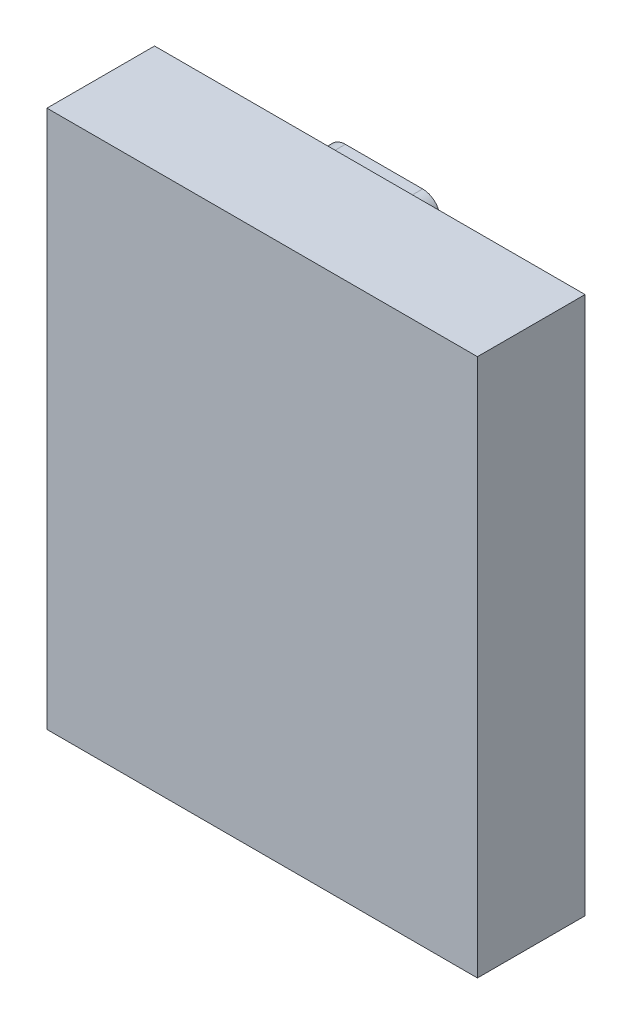
ISO-10303-21;
HEADER;
FILE_DESCRIPTION(('STEP AP214'),'2;1');
FILE_NAME('part.step','',(''),(''),'','','');
FILE_SCHEMA(('AUTOMOTIVE_DESIGN { 1 0 10303 214 1 1 1 1 }'));
ENDSEC;
DATA;
#1=APPLICATION_CONTEXT('core data for automotive mechanical design processes');
#2=APPLICATION_PROTOCOL_DEFINITION('international standard','automotive_design',2000,#1);
#3=PRODUCT_CONTEXT('',#1,'mechanical');
#4=PRODUCT('Part','Part','',(#3));
#5=PRODUCT_RELATED_PRODUCT_CATEGORY('part','',(#4));
#6=PRODUCT_DEFINITION_FORMATION('','',#4);
#7=PRODUCT_DEFINITION_CONTEXT('part definition',#1,'design');
#8=PRODUCT_DEFINITION('design','',#6,#7);
#9=PRODUCT_DEFINITION_SHAPE('','',#8);
#10=(LENGTH_UNIT() NAMED_UNIT(*) SI_UNIT(.MILLI.,.METRE.));
#11=(NAMED_UNIT(*) PLANE_ANGLE_UNIT() SI_UNIT($,.RADIAN.));
#12=(NAMED_UNIT(*) SI_UNIT($,.STERADIAN.) SOLID_ANGLE_UNIT());
#13=UNCERTAINTY_MEASURE_WITH_UNIT(LENGTH_MEASURE(1.E-05),#10,'distance_accuracy_value','');
#14=(GEOMETRIC_REPRESENTATION_CONTEXT(3) GLOBAL_UNCERTAINTY_ASSIGNED_CONTEXT((#13)) GLOBAL_UNIT_ASSIGNED_CONTEXT((#10,
#11,#12)) REPRESENTATION_CONTEXT('',''));
#15=CARTESIAN_POINT('',(0.,0.,0.));
#16=DIRECTION('',(0.,0.,1.));
#17=DIRECTION('',(1.,0.,0.));
#18=AXIS2_PLACEMENT_3D('',#15,#16,#17);
#19=CARTESIAN_POINT('',(0.,0.,0.));
#20=DIRECTION('',(0.,0.,1.));
#21=DIRECTION('',(1.,0.,0.));
#22=AXIS2_PLACEMENT_3D('',#19,#20,#21);
#23=PLANE('',#22);
#24=CARTESIAN_POINT('',(0.897871535022493,51.1614322212867,0.));
#25=DIRECTION('',(0.,0.,-1.));
#26=DIRECTION('',(-1.,0.,0.));
#27=AXIS2_PLACEMENT_3D('',#24,#25,#26);
#28=CIRCLE('',#27,3.19985101136071);
#29=CARTESIAN_POINT('',(-2.30197947633822,51.1614322212867,0.));
#30=VERTEX_POINT('',#29);
#31=EDGE_CURVE('E211',#30,#30,#28,.T.);
#32=ORIENTED_EDGE('',*,*,#31,.F.);
#33=EDGE_LOOP('',(#32));
#34=FACE_BOUND('',#33,.T.);
#35=DIRECTION('',(0.,-1.,0.));
#36=VECTOR('',#35,1.);
#37=CARTESIAN_POINT('',(-57.0187039270216,0.,0.));
#38=LINE('',#37,#36);
#39=CARTESIAN_POINT('',(-57.0187039270216,46.1110977704638,0.));
#40=VERTEX_POINT('',#39);
#41=CARTESIAN_POINT('',(-57.0187039270217,-33.8889022295362,0.));
#42=VERTEX_POINT('',#41);
#43=EDGE_CURVE('E246',#40,#42,#38,.T.);
#44=ORIENTED_EDGE('',*,*,#43,.T.);
#45=DIRECTION('',(-1.,0.,0.));
#46=VECTOR('',#45,1.);
#47=CARTESIAN_POINT('',(0.,-33.8889022295362,0.));
#48=LINE('',#47,#46);
#49=CARTESIAN_POINT('',(6.98129607297834,-33.8889022295362,0.));
#50=VERTEX_POINT('',#49);
#51=EDGE_CURVE('E255',#50,#42,#48,.T.);
#52=ORIENTED_EDGE('',*,*,#51,.F.);
#53=DIRECTION('',(0.,-1.,0.));
#54=VECTOR('',#53,1.);
#55=CARTESIAN_POINT('',(6.98129607297835,0.,0.));
#56=LINE('',#55,#54);
#57=CARTESIAN_POINT('',(6.98129607297835,46.1110977704638,0.));
#58=VERTEX_POINT('',#57);
#59=EDGE_CURVE('E268',#58,#50,#56,.T.);
#60=ORIENTED_EDGE('',*,*,#59,.F.);
#61=DIRECTION('',(-1.,0.,0.));
#62=VECTOR('',#61,1.);
#63=CARTESIAN_POINT('',(0.,46.1110977704638,0.));
#64=LINE('',#63,#62);
#65=EDGE_CURVE('E264',#58,#40,#64,.T.);
#66=ORIENTED_EDGE('',*,*,#65,.T.);
#67=EDGE_LOOP('',(#44,#52,#60,#66));
#68=FACE_BOUND('',#67,.T.);
#69=DIRECTION('',(0.,-1.,0.));
#70=VECTOR('',#69,1.);
#71=CARTESIAN_POINT('',(-65.342231874252,55.7188010297461,0.));
#72=LINE('',#71,#70);
#73=CARTESIAN_POINT('',(-65.342231874252,55.7188010297461,0.));
#74=VERTEX_POINT('',#73);
#75=CARTESIAN_POINT('',(-65.342231874252,-44.2811989702539,0.));
#76=VERTEX_POINT('',#75);
#77=EDGE_CURVE('E273',#74,#76,#72,.T.);
#78=ORIENTED_EDGE('',*,*,#77,.F.);
#79=DIRECTION('',(-1.,0.,0.));
#80=VECTOR('',#79,1.);
#81=CARTESIAN_POINT('',(-65.342231874252,55.7188010297461,0.));
#82=LINE('',#81,#80);
#83=CARTESIAN_POINT('',(14.657768125748,55.7188010297461,0.));
#84=VERTEX_POINT('',#83);
#85=EDGE_CURVE('E282',#84,#74,#82,.T.);
#86=ORIENTED_EDGE('',*,*,#85,.F.);
#87=DIRECTION('',(0.,1.,0.));
#88=VECTOR('',#87,1.);
#89=CARTESIAN_POINT('',(14.657768125748,55.7188010297461,0.));
#90=LINE('',#89,#88);
#91=CARTESIAN_POINT('',(14.657768125748,-44.2811989702539,0.));
#92=VERTEX_POINT('',#91);
#93=EDGE_CURVE('E299',#92,#84,#90,.T.);
#94=ORIENTED_EDGE('',*,*,#93,.F.);
#95=DIRECTION('',(1.,0.,0.));
#96=VECTOR('',#95,1.);
#97=CARTESIAN_POINT('',(-65.342231874252,-44.2811989702539,0.));
#98=LINE('',#97,#96);
#99=EDGE_CURVE('E294',#76,#92,#98,.T.);
#100=ORIENTED_EDGE('',*,*,#99,.F.);
#101=EDGE_LOOP('',(#78,#86,#94,#100));
#102=FACE_BOUND('',#101,.T.);
#103=CARTESIAN_POINT('',(-18.5237803035046,51.3364412723932,0.));
#104=DIRECTION('',(0.,0.,-1.));
#105=DIRECTION('',(-1.,0.,0.));
#106=AXIS2_PLACEMENT_3D('',#103,#104,#105);
#107=CIRCLE('',#106,3.28746772161036);
#108=CARTESIAN_POINT('',(-18.5237803035046,54.6239089940036,0.));
#109=VERTEX_POINT('',#108);
#110=CARTESIAN_POINT('',(-18.5237803035046,48.0489735507829,0.));
#111=VERTEX_POINT('',#110);
#112=EDGE_CURVE('E88',#109,#111,#107,.T.);
#113=ORIENTED_EDGE('',*,*,#112,.F.);
#114=DIRECTION('',(1.,0.,0.));
#115=VECTOR('',#114,1.);
#116=CARTESIAN_POINT('',(-18.5237803035046,54.6239089940036,0.));
#117=LINE('',#116,#115);
#118=CARTESIAN_POINT('',(-32.8912318275796,54.6239089940036,0.));
#119=VERTEX_POINT('',#118);
#120=EDGE_CURVE('E221',#119,#109,#117,.T.);
#121=ORIENTED_EDGE('',*,*,#120,.F.);
#122=CARTESIAN_POINT('',(-32.8912318275796,51.3364412723932,0.));
#123=DIRECTION('',(0.,0.,-1.));
#124=DIRECTION('',(-1.,0.,0.));
#125=AXIS2_PLACEMENT_3D('',#122,#123,#124);
#126=CIRCLE('',#125,3.28746772161036);
#127=CARTESIAN_POINT('',(-32.8912318275796,48.0489735507829,0.));
#128=VERTEX_POINT('',#127);
#129=EDGE_CURVE('E231',#128,#119,#126,.T.);
#130=ORIENTED_EDGE('',*,*,#129,.F.);
#131=DIRECTION('',(-1.,0.,0.));
#132=VECTOR('',#131,1.);
#133=CARTESIAN_POINT('',(-18.5237803035046,48.0489735507829,0.));
#134=LINE('',#133,#132);
#135=EDGE_CURVE('E234',#111,#128,#134,.T.);
#136=ORIENTED_EDGE('',*,*,#135,.F.);
#137=EDGE_LOOP('',(#113,#121,#130,#136));
#138=FACE_BOUND('',#137,.T.);
#139=ADVANCED_FACE('F65',(#34,#68,#102,#138),#23,.F.);
#140=CARTESIAN_POINT('',(-65.342231874252,55.7188010297461,20.));
#141=DIRECTION('',(1.,0.,0.));
#142=DIRECTION('',(0.,0.,-1.));
#143=AXIS2_PLACEMENT_3D('',#140,#141,#142);
#144=PLANE('',#143);
#145=ORIENTED_EDGE('',*,*,#77,.T.);
#146=DIRECTION('',(0.,0.,-1.));
#147=VECTOR('',#146,1.);
#148=CARTESIAN_POINT('',(-65.342231874252,-44.2811989702539,20.));
#149=LINE('',#148,#147);
#150=CARTESIAN_POINT('',(-65.342231874252,-44.2811989702539,20.));
#151=VERTEX_POINT('',#150);
#152=EDGE_CURVE('E12',#151,#76,#149,.T.);
#153=ORIENTED_EDGE('',*,*,#152,.F.);
#154=DIRECTION('',(0.,-1.,0.));
#155=VECTOR('',#154,1.);
#156=CARTESIAN_POINT('',(-65.342231874252,55.7188010297461,20.));
#157=LINE('',#156,#155);
#158=CARTESIAN_POINT('',(-65.342231874252,55.7188010297461,20.));
#159=VERTEX_POINT('',#158);
#160=EDGE_CURVE('E284',#159,#151,#157,.T.);
#161=ORIENTED_EDGE('',*,*,#160,.F.);
#162=DIRECTION('',(0.,0.,-1.));
#163=VECTOR('',#162,1.);
#164=CARTESIAN_POINT('',(-65.342231874252,55.7188010297461,20.));
#165=LINE('',#164,#163);
#166=EDGE_CURVE('E292',#159,#74,#165,.T.);
#167=ORIENTED_EDGE('',*,*,#166,.T.);
#168=EDGE_LOOP('',(#145,#153,#161,#167));
#169=FACE_BOUND('',#168,.T.);
#170=ADVANCED_FACE('F62',(#169),#144,.F.);
#171=CARTESIAN_POINT('',(-65.342231874252,-44.2811989702539,20.));
#172=DIRECTION('',(0.,1.,0.));
#173=DIRECTION('',(0.,0.,1.));
#174=AXIS2_PLACEMENT_3D('',#171,#172,#173);
#175=PLANE('',#174);
#176=DIRECTION('',(1.,0.,0.));
#177=VECTOR('',#176,1.);
#178=CARTESIAN_POINT('',(-58.0956260996622,-44.2811989702539,8.31989398923459));
#179=LINE('',#178,#177);
#180=CARTESIAN_POINT('',(-58.0956260996622,-44.2811989702539,8.31989398923459));
#181=VERTEX_POINT('',#180);
#182=CARTESIAN_POINT('',(-49.7757321104279,-44.2811989702539,8.31989398923459));
#183=VERTEX_POINT('',#182);
#184=EDGE_CURVE('E202',#181,#183,#179,.T.);
#185=ORIENTED_EDGE('',*,*,#184,.F.);
#186=CARTESIAN_POINT('',(-58.0956260996622,-44.2811989702539,9.92714623715485));
#187=DIRECTION('',(0.,-1.,0.));
#188=DIRECTION('',(0.,0.,-1.));
#189=AXIS2_PLACEMENT_3D('',#186,#187,#188);
#190=CIRCLE('',#189,1.60725224792026);
#191=CARTESIAN_POINT('',(-58.0956260996622,-44.2811989702539,11.5343984850751));
#192=VERTEX_POINT('',#191);
#193=EDGE_CURVE('E80',#192,#181,#190,.T.);
#194=ORIENTED_EDGE('',*,*,#193,.F.);
#195=DIRECTION('',(-1.,0.,0.));
#196=VECTOR('',#195,1.);
#197=CARTESIAN_POINT('',(-58.0956260996622,-44.2811989702539,11.5343984850751));
#198=LINE('',#197,#196);
#199=CARTESIAN_POINT('',(-49.7757321104279,-44.2811989702539,11.5343984850751));
#200=VERTEX_POINT('',#199);
#201=EDGE_CURVE('E198',#200,#192,#198,.T.);
#202=ORIENTED_EDGE('',*,*,#201,.F.);
#203=CARTESIAN_POINT('',(-49.7757321104279,-44.2811989702539,9.92714623715485));
#204=DIRECTION('',(0.,-1.,0.));
#205=DIRECTION('',(0.,0.,-1.));
#206=AXIS2_PLACEMENT_3D('',#203,#204,#205);
#207=CIRCLE('',#206,1.60725224792026);
#208=EDGE_CURVE('E200',#183,#200,#207,.T.);
#209=ORIENTED_EDGE('',*,*,#208,.F.);
#210=EDGE_LOOP('',(#185,#194,#202,#209));
#211=FACE_BOUND('',#210,.T.);
#212=ORIENTED_EDGE('',*,*,#99,.T.);
#213=DIRECTION('',(0.,0.,-1.));
#214=VECTOR('',#213,1.);
#215=CARTESIAN_POINT('',(14.657768125748,-44.2811989702539,20.));
#216=LINE('',#215,#214);
#217=CARTESIAN_POINT('',(14.657768125748,-44.2811989702539,20.));
#218=VERTEX_POINT('',#217);
#219=EDGE_CURVE('E72',#218,#92,#216,.T.);
#220=ORIENTED_EDGE('',*,*,#219,.F.);
#221=DIRECTION('',(1.,0.,0.));
#222=VECTOR('',#221,1.);
#223=CARTESIAN_POINT('',(-65.342231874252,-44.2811989702539,20.));
#224=LINE('',#223,#222);
#225=EDGE_CURVE('E283',#151,#218,#224,.T.);
#226=ORIENTED_EDGE('',*,*,#225,.F.);
#227=ORIENTED_EDGE('',*,*,#152,.T.);
#228=EDGE_LOOP('',(#212,#220,#226,#227));
#229=FACE_BOUND('',#228,.T.);
#230=ADVANCED_FACE('F323',(#211,#229),#175,.F.);
#231=CARTESIAN_POINT('',(14.657768125748,55.7188010297461,20.));
#232=DIRECTION('',(-1.,0.,0.));
#233=DIRECTION('',(0.,0.,1.));
#234=AXIS2_PLACEMENT_3D('',#231,#232,#233);
#235=PLANE('',#234);
#236=ORIENTED_EDGE('',*,*,#93,.T.);
#237=DIRECTION('',(0.,0.,-1.));
#238=VECTOR('',#237,1.);
#239=CARTESIAN_POINT('',(14.657768125748,55.7188010297461,20.));
#240=LINE('',#239,#238);
#241=CARTESIAN_POINT('',(14.657768125748,55.7188010297461,20.));
#242=VERTEX_POINT('',#241);
#243=EDGE_CURVE('E303',#242,#84,#240,.T.);
#244=ORIENTED_EDGE('',*,*,#243,.F.);
#245=DIRECTION('',(0.,1.,0.));
#246=VECTOR('',#245,1.);
#247=CARTESIAN_POINT('',(14.657768125748,55.7188010297461,20.));
#248=LINE('',#247,#246);
#249=EDGE_CURVE('E289',#218,#242,#248,.T.);
#250=ORIENTED_EDGE('',*,*,#249,.F.);
#251=ORIENTED_EDGE('',*,*,#219,.T.);
#252=EDGE_LOOP('',(#236,#244,#250,#251));
#253=FACE_BOUND('',#252,.T.);
#254=ADVANCED_FACE('F306',(#253),#235,.F.);
#255=CARTESIAN_POINT('',(-65.342231874252,55.7188010297461,20.));
#256=DIRECTION('',(0.,-1.,0.));
#257=DIRECTION('',(0.,0.,-1.));
#258=AXIS2_PLACEMENT_3D('',#255,#256,#257);
#259=PLANE('',#258);
#260=ORIENTED_EDGE('',*,*,#85,.T.);
#261=ORIENTED_EDGE('',*,*,#166,.F.);
#262=DIRECTION('',(-1.,0.,0.));
#263=VECTOR('',#262,1.);
#264=CARTESIAN_POINT('',(-65.342231874252,55.7188010297461,20.));
#265=LINE('',#264,#263);
#266=EDGE_CURVE('E290',#242,#159,#265,.T.);
#267=ORIENTED_EDGE('',*,*,#266,.F.);
#268=ORIENTED_EDGE('',*,*,#243,.T.);
#269=EDGE_LOOP('',(#260,#261,#267,#268));
#270=FACE_BOUND('',#269,.T.);
#271=ADVANCED_FACE('F316',(#270),#259,.F.);
#272=CARTESIAN_POINT('',(0.,0.,20.));
#273=DIRECTION('',(0.,0.,1.));
#274=DIRECTION('',(1.,0.,0.));
#275=AXIS2_PLACEMENT_3D('',#272,#273,#274);
#276=PLANE('',#275);
#277=ORIENTED_EDGE('',*,*,#160,.T.);
#278=ORIENTED_EDGE('',*,*,#225,.T.);
#279=ORIENTED_EDGE('',*,*,#249,.T.);
#280=ORIENTED_EDGE('',*,*,#266,.T.);
#281=EDGE_LOOP('',(#277,#278,#279,#280));
#282=FACE_BOUND('',#281,.T.);
#283=ADVANCED_FACE('F325',(#282),#276,.T.);
#284=CARTESIAN_POINT('',(-57.0187039270216,0.,17.));
#285=DIRECTION('',(1.,0.,0.));
#286=DIRECTION('',(0.,1.,0.));
#287=AXIS2_PLACEMENT_3D('',#284,#285,#286);
#288=PLANE('',#287);
#289=ORIENTED_EDGE('',*,*,#43,.F.);
#290=DIRECTION('',(0.,0.,-1.));
#291=VECTOR('',#290,1.);
#292=CARTESIAN_POINT('',(-57.0187039270216,46.1110977704638,17.));
#293=LINE('',#292,#291);
#294=CARTESIAN_POINT('',(-57.0187039270216,46.1110977704638,17.));
#295=VERTEX_POINT('',#294);
#296=EDGE_CURVE('E265',#295,#40,#293,.T.);
#297=ORIENTED_EDGE('',*,*,#296,.F.);
#298=DIRECTION('',(0.,-1.,0.));
#299=VECTOR('',#298,1.);
#300=CARTESIAN_POINT('',(-57.0187039270216,0.,17.));
#301=LINE('',#300,#299);
#302=CARTESIAN_POINT('',(-57.0187039270217,-33.8889022295362,17.));
#303=VERTEX_POINT('',#302);
#304=EDGE_CURVE('E253',#295,#303,#301,.T.);
#305=ORIENTED_EDGE('',*,*,#304,.T.);
#306=DIRECTION('',(0.,0.,-1.));
#307=VECTOR('',#306,1.);
#308=CARTESIAN_POINT('',(-57.0187039270217,-33.8889022295362,17.));
#309=LINE('',#308,#307);
#310=EDGE_CURVE('E275',#303,#42,#309,.T.);
#311=ORIENTED_EDGE('',*,*,#310,.T.);
#312=EDGE_LOOP('',(#289,#297,#305,#311));
#313=FACE_BOUND('',#312,.T.);
#314=ADVANCED_FACE('F349',(#313),#288,.T.);
#315=CARTESIAN_POINT('',(0.,46.1110977704638,17.));
#316=DIRECTION('',(0.,-1.,0.));
#317=DIRECTION('',(0.,0.,-1.));
#318=AXIS2_PLACEMENT_3D('',#315,#316,#317);
#319=PLANE('',#318);
#320=ORIENTED_EDGE('',*,*,#65,.F.);
#321=DIRECTION('',(0.,0.,-1.));
#322=VECTOR('',#321,1.);
#323=CARTESIAN_POINT('',(6.98129607297835,46.1110977704638,17.));
#324=LINE('',#323,#322);
#325=CARTESIAN_POINT('',(6.98129607297835,46.1110977704638,17.));
#326=VERTEX_POINT('',#325);
#327=EDGE_CURVE('E279',#326,#58,#324,.T.);
#328=ORIENTED_EDGE('',*,*,#327,.F.);
#329=DIRECTION('',(-1.,0.,0.));
#330=VECTOR('',#329,1.);
#331=CARTESIAN_POINT('',(0.,46.1110977704638,17.));
#332=LINE('',#331,#330);
#333=EDGE_CURVE('E251',#326,#295,#332,.T.);
#334=ORIENTED_EDGE('',*,*,#333,.T.);
#335=ORIENTED_EDGE('',*,*,#296,.T.);
#336=EDGE_LOOP('',(#320,#328,#334,#335));
#337=FACE_BOUND('',#336,.T.);
#338=ADVANCED_FACE('F355',(#337),#319,.T.);
#339=CARTESIAN_POINT('',(6.98129607297835,0.,17.));
#340=DIRECTION('',(1.,0.,0.));
#341=DIRECTION('',(0.,1.,0.));
#342=AXIS2_PLACEMENT_3D('',#339,#340,#341);
#343=PLANE('',#342);
#344=ORIENTED_EDGE('',*,*,#59,.T.);
#345=DIRECTION('',(0.,0.,-1.));
#346=VECTOR('',#345,1.);
#347=CARTESIAN_POINT('',(6.98129607297834,-33.8889022295362,17.));
#348=LINE('',#347,#346);
#349=CARTESIAN_POINT('',(6.98129607297834,-33.8889022295362,17.));
#350=VERTEX_POINT('',#349);
#351=EDGE_CURVE('E274',#350,#50,#348,.T.);
#352=ORIENTED_EDGE('',*,*,#351,.F.);
#353=DIRECTION('',(0.,-1.,0.));
#354=VECTOR('',#353,1.);
#355=CARTESIAN_POINT('',(6.98129607297835,0.,17.));
#356=LINE('',#355,#354);
#357=EDGE_CURVE('E258',#326,#350,#356,.T.);
#358=ORIENTED_EDGE('',*,*,#357,.F.);
#359=ORIENTED_EDGE('',*,*,#327,.T.);
#360=EDGE_LOOP('',(#344,#352,#358,#359));
#361=FACE_BOUND('',#360,.T.);
#362=ADVANCED_FACE('F357',(#361),#343,.F.);
#363=CARTESIAN_POINT('',(0.,-33.8889022295362,17.));
#364=DIRECTION('',(0.,-1.,0.));
#365=DIRECTION('',(0.,0.,-1.));
#366=AXIS2_PLACEMENT_3D('',#363,#364,#365);
#367=PLANE('',#366);
#368=ORIENTED_EDGE('',*,*,#51,.T.);
#369=ORIENTED_EDGE('',*,*,#310,.F.);
#370=DIRECTION('',(-1.,0.,0.));
#371=VECTOR('',#370,1.);
#372=CARTESIAN_POINT('',(0.,-33.8889022295362,17.));
#373=LINE('',#372,#371);
#374=EDGE_CURVE('E259',#350,#303,#373,.T.);
#375=ORIENTED_EDGE('',*,*,#374,.F.);
#376=ORIENTED_EDGE('',*,*,#351,.T.);
#377=EDGE_LOOP('',(#368,#369,#375,#376));
#378=FACE_BOUND('',#377,.T.);
#379=ADVANCED_FACE('F364',(#378),#367,.F.);
#380=CARTESIAN_POINT('',(0.,0.,17.));
#381=DIRECTION('',(0.,0.,-1.));
#382=DIRECTION('',(-1.,0.,0.));
#383=AXIS2_PLACEMENT_3D('',#380,#381,#382);
#384=PLANE('',#383);
#385=ORIENTED_EDGE('',*,*,#304,.F.);
#386=ORIENTED_EDGE('',*,*,#333,.F.);
#387=ORIENTED_EDGE('',*,*,#357,.T.);
#388=ORIENTED_EDGE('',*,*,#374,.T.);
#389=EDGE_LOOP('',(#385,#386,#387,#388));
#390=FACE_BOUND('',#389,.T.);
#391=ADVANCED_FACE('F369',(#390),#384,.T.);
#392=CARTESIAN_POINT('',(-18.5237803035046,51.3364412723932,-3.));
#393=DIRECTION('',(0.,0.,1.));
#394=DIRECTION('',(1.,0.,0.));
#395=AXIS2_PLACEMENT_3D('',#392,#393,#394);
#396=CYLINDRICAL_SURFACE('',#395,3.28746772161036);
#397=ORIENTED_EDGE('',*,*,#112,.T.);
#398=DIRECTION('',(0.,0.,1.));
#399=VECTOR('',#398,1.);
#400=CARTESIAN_POINT('',(-18.5237803035046,48.0489735507829,-3.));
#401=LINE('',#400,#399);
#402=CARTESIAN_POINT('',(-18.5237803035046,48.0489735507829,-3.));
#403=VERTEX_POINT('',#402);
#404=EDGE_CURVE('E249',#403,#111,#401,.T.);
#405=ORIENTED_EDGE('',*,*,#404,.F.);
#406=CARTESIAN_POINT('',(-18.5237803035046,51.3364412723932,-3.));
#407=DIRECTION('',(0.,0.,-1.));
#408=DIRECTION('',(-1.,0.,0.));
#409=AXIS2_PLACEMENT_3D('',#406,#407,#408);
#410=CIRCLE('',#409,3.28746772161036);
#411=CARTESIAN_POINT('',(-18.5237803035046,54.6239089940036,-3.));
#412=VERTEX_POINT('',#411);
#413=EDGE_CURVE('E219',#412,#403,#410,.T.);
#414=ORIENTED_EDGE('',*,*,#413,.F.);
#415=DIRECTION('',(0.,0.,1.));
#416=VECTOR('',#415,1.);
#417=CARTESIAN_POINT('',(-18.5237803035046,54.6239089940036,-3.));
#418=LINE('',#417,#416);
#419=EDGE_CURVE('E227',#412,#109,#418,.T.);
#420=ORIENTED_EDGE('',*,*,#419,.T.);
#421=EDGE_LOOP('',(#397,#405,#414,#420));
#422=FACE_BOUND('',#421,.T.);
#423=ADVANCED_FACE('F373',(#422),#396,.T.);
#424=CARTESIAN_POINT('',(-18.5237803035046,48.0489735507829,-3.));
#425=DIRECTION('',(0.,1.,0.));
#426=DIRECTION('',(0.,0.,1.));
#427=AXIS2_PLACEMENT_3D('',#424,#425,#426);
#428=PLANE('',#427);
#429=ORIENTED_EDGE('',*,*,#135,.T.);
#430=DIRECTION('',(0.,0.,1.));
#431=VECTOR('',#430,1.);
#432=CARTESIAN_POINT('',(-32.8912318275796,48.0489735507829,-3.));
#433=LINE('',#432,#431);
#434=CARTESIAN_POINT('',(-32.8912318275796,48.0489735507829,-3.));
#435=VERTEX_POINT('',#434);
#436=EDGE_CURVE('E243',#435,#128,#433,.T.);
#437=ORIENTED_EDGE('',*,*,#436,.F.);
#438=DIRECTION('',(-1.,0.,0.));
#439=VECTOR('',#438,1.);
#440=CARTESIAN_POINT('',(-18.5237803035046,48.0489735507829,-3.));
#441=LINE('',#440,#439);
#442=EDGE_CURVE('E224',#403,#435,#441,.T.);
#443=ORIENTED_EDGE('',*,*,#442,.F.);
#444=ORIENTED_EDGE('',*,*,#404,.T.);
#445=EDGE_LOOP('',(#429,#437,#443,#444));
#446=FACE_BOUND('',#445,.T.);
#447=ADVANCED_FACE('F380',(#446),#428,.F.);
#448=CARTESIAN_POINT('',(-32.8912318275796,51.3364412723932,-3.));
#449=DIRECTION('',(0.,0.,1.));
#450=DIRECTION('',(1.,0.,0.));
#451=AXIS2_PLACEMENT_3D('',#448,#449,#450);
#452=CYLINDRICAL_SURFACE('',#451,3.28746772161036);
#453=ORIENTED_EDGE('',*,*,#129,.T.);
#454=DIRECTION('',(0.,0.,1.));
#455=VECTOR('',#454,1.);
#456=CARTESIAN_POINT('',(-32.8912318275796,54.6239089940036,-3.));
#457=LINE('',#456,#455);
#458=CARTESIAN_POINT('',(-32.8912318275796,54.6239089940036,-3.));
#459=VERTEX_POINT('',#458);
#460=EDGE_CURVE('E244',#459,#119,#457,.T.);
#461=ORIENTED_EDGE('',*,*,#460,.F.);
#462=CARTESIAN_POINT('',(-32.8912318275796,51.3364412723932,-3.));
#463=DIRECTION('',(0.,0.,-1.));
#464=DIRECTION('',(-1.,0.,0.));
#465=AXIS2_PLACEMENT_3D('',#462,#463,#464);
#466=CIRCLE('',#465,3.28746772161036);
#467=EDGE_CURVE('E229',#435,#459,#466,.T.);
#468=ORIENTED_EDGE('',*,*,#467,.F.);
#469=ORIENTED_EDGE('',*,*,#436,.T.);
#470=EDGE_LOOP('',(#453,#461,#468,#469));
#471=FACE_BOUND('',#470,.T.);
#472=ADVANCED_FACE('F381',(#471),#452,.T.);
#473=CARTESIAN_POINT('',(-18.5237803035046,54.6239089940036,-3.));
#474=DIRECTION('',(0.,-1.,0.));
#475=DIRECTION('',(0.,0.,-1.));
#476=AXIS2_PLACEMENT_3D('',#473,#474,#475);
#477=PLANE('',#476);
#478=ORIENTED_EDGE('',*,*,#120,.T.);
#479=ORIENTED_EDGE('',*,*,#419,.F.);
#480=DIRECTION('',(1.,0.,0.));
#481=VECTOR('',#480,1.);
#482=CARTESIAN_POINT('',(-18.5237803035046,54.6239089940036,-3.));
#483=LINE('',#482,#481);
#484=EDGE_CURVE('E230',#459,#412,#483,.T.);
#485=ORIENTED_EDGE('',*,*,#484,.F.);
#486=ORIENTED_EDGE('',*,*,#460,.T.);
#487=EDGE_LOOP('',(#478,#479,#485,#486));
#488=FACE_BOUND('',#487,.T.);
#489=ADVANCED_FACE('F384',(#488),#477,.F.);
#490=CARTESIAN_POINT('',(-18.5237803035046,51.3364412723932,-3.));
#491=DIRECTION('',(0.,0.,-1.));
#492=DIRECTION('',(-1.,0.,0.));
#493=AXIS2_PLACEMENT_3D('',#490,#491,#492);
#494=PLANE('',#493);
#495=ORIENTED_EDGE('',*,*,#413,.T.);
#496=ORIENTED_EDGE('',*,*,#442,.T.);
#497=ORIENTED_EDGE('',*,*,#467,.T.);
#498=ORIENTED_EDGE('',*,*,#484,.T.);
#499=EDGE_LOOP('',(#495,#496,#497,#498));
#500=FACE_BOUND('',#499,.T.);
#501=ADVANCED_FACE('F386',(#500),#494,.T.);
#502=CARTESIAN_POINT('',(0.897871535022493,51.1614322212867,2.7));
#503=DIRECTION('',(0.,0.,-1.));
#504=DIRECTION('',(-1.,0.,0.));
#505=AXIS2_PLACEMENT_3D('',#502,#503,#504);
#506=CYLINDRICAL_SURFACE('',#505,3.19985101136071);
#507=CARTESIAN_POINT('',(0.897871535022493,51.1614322212867,2.7));
#508=DIRECTION('',(0.,0.,-1.));
#509=DIRECTION('',(-1.,0.,0.));
#510=AXIS2_PLACEMENT_3D('',#507,#508,#509);
#511=CIRCLE('',#510,3.19985101136071);
#512=CARTESIAN_POINT('',(-2.30197947633822,51.1614322212867,2.7));
#513=VERTEX_POINT('',#512);
#514=EDGE_CURVE('E214',#513,#513,#511,.T.);
#515=CARTESIAN_POINT('',(-2.30197947633822,51.1614322212867,2.7));
#516=CARTESIAN_POINT('',(-2.30197947633822,51.1614322212867,2.671875));
#517=CARTESIAN_POINT('',(-2.30197947633822,51.1614322212867,2.64375));
#518=CARTESIAN_POINT('',(-2.30197947633822,51.1614322212867,2.5875));
#519=CARTESIAN_POINT('',(-2.30197947633822,51.1614322212867,2.559375));
#520=CARTESIAN_POINT('',(-2.30197947633822,51.1614322212867,2.503125));
#521=CARTESIAN_POINT('',(-2.30197947633822,51.1614322212867,2.475));
#522=CARTESIAN_POINT('',(-2.30197947633822,51.1614322212867,2.41875));
#523=CARTESIAN_POINT('',(-2.30197947633822,51.1614322212867,2.390625));
#524=CARTESIAN_POINT('',(-2.30197947633822,51.1614322212867,2.334375));
#525=CARTESIAN_POINT('',(-2.30197947633822,51.1614322212867,2.30625));
#526=CARTESIAN_POINT('',(-2.30197947633822,51.1614322212867,2.25));
#527=CARTESIAN_POINT('',(-2.30197947633822,51.1614322212867,2.221875));
#528=CARTESIAN_POINT('',(-2.30197947633822,51.1614322212867,2.165625));
#529=CARTESIAN_POINT('',(-2.30197947633822,51.1614322212867,2.1375));
#530=CARTESIAN_POINT('',(-2.30197947633822,51.1614322212867,2.08125));
#531=CARTESIAN_POINT('',(-2.30197947633822,51.1614322212867,2.053125));
#532=CARTESIAN_POINT('',(-2.30197947633822,51.1614322212867,1.996875));
#533=CARTESIAN_POINT('',(-2.30197947633822,51.1614322212867,1.96875));
#534=CARTESIAN_POINT('',(-2.30197947633822,51.1614322212867,1.9125));
#535=CARTESIAN_POINT('',(-2.30197947633822,51.1614322212867,1.884375));
#536=CARTESIAN_POINT('',(-2.30197947633822,51.1614322212867,1.828125));
#537=CARTESIAN_POINT('',(-2.30197947633822,51.1614322212867,1.8));
#538=CARTESIAN_POINT('',(-2.30197947633822,51.1614322212867,1.74375));
#539=CARTESIAN_POINT('',(-2.30197947633822,51.1614322212867,1.715625));
#540=CARTESIAN_POINT('',(-2.30197947633822,51.1614322212867,1.659375));
#541=CARTESIAN_POINT('',(-2.30197947633822,51.1614322212867,1.63125));
#542=CARTESIAN_POINT('',(-2.30197947633822,51.1614322212867,1.575));
#543=CARTESIAN_POINT('',(-2.30197947633822,51.1614322212867,1.546875));
#544=CARTESIAN_POINT('',(-2.30197947633822,51.1614322212867,1.490625));
#545=CARTESIAN_POINT('',(-2.30197947633822,51.1614322212867,1.4625));
#546=CARTESIAN_POINT('',(-2.30197947633822,51.1614322212867,1.40625));
#547=CARTESIAN_POINT('',(-2.30197947633822,51.1614322212867,1.378125));
#548=CARTESIAN_POINT('',(-2.30197947633822,51.1614322212867,1.321875));
#549=CARTESIAN_POINT('',(-2.30197947633822,51.1614322212867,1.29375));
#550=CARTESIAN_POINT('',(-2.30197947633822,51.1614322212867,1.2375));
#551=CARTESIAN_POINT('',(-2.30197947633822,51.1614322212867,1.209375));
#552=CARTESIAN_POINT('',(-2.30197947633822,51.1614322212867,1.153125));
#553=CARTESIAN_POINT('',(-2.30197947633822,51.1614322212867,1.125));
#554=CARTESIAN_POINT('',(-2.30197947633822,51.1614322212867,1.06875));
#555=CARTESIAN_POINT('',(-2.30197947633822,51.1614322212867,1.040625));
#556=CARTESIAN_POINT('',(-2.30197947633822,51.1614322212867,0.984375));
#557=CARTESIAN_POINT('',(-2.30197947633822,51.1614322212867,0.95625));
#558=CARTESIAN_POINT('',(-2.30197947633822,51.1614322212867,0.9));
#559=CARTESIAN_POINT('',(-2.30197947633822,51.1614322212867,0.871875000000001));
#560=CARTESIAN_POINT('',(-2.30197947633822,51.1614322212867,0.815625));
#561=CARTESIAN_POINT('',(-2.30197947633822,51.1614322212867,0.787500000000001));
#562=CARTESIAN_POINT('',(-2.30197947633822,51.1614322212867,0.731250000000001));
#563=CARTESIAN_POINT('',(-2.30197947633822,51.1614322212867,0.703125000000001));
#564=CARTESIAN_POINT('',(-2.30197947633822,51.1614322212867,0.646875000000001));
#565=CARTESIAN_POINT('',(-2.30197947633822,51.1614322212867,0.61875));
#566=CARTESIAN_POINT('',(-2.30197947633822,51.1614322212867,0.5625));
#567=CARTESIAN_POINT('',(-2.30197947633822,51.1614322212867,0.534375000000001));
#568=CARTESIAN_POINT('',(-2.30197947633822,51.1614322212867,0.478125000000001));
#569=CARTESIAN_POINT('',(-2.30197947633822,51.1614322212867,0.45));
#570=CARTESIAN_POINT('',(-2.30197947633822,51.1614322212867,0.39375));
#571=CARTESIAN_POINT('',(-2.30197947633822,51.1614322212867,0.365625));
#572=CARTESIAN_POINT('',(-2.30197947633822,51.1614322212867,0.309375));
#573=CARTESIAN_POINT('',(-2.30197947633822,51.1614322212867,0.28125));
#574=CARTESIAN_POINT('',(-2.30197947633822,51.1614322212867,0.225));
#575=CARTESIAN_POINT('',(-2.30197947633822,51.1614322212867,0.196875));
#576=CARTESIAN_POINT('',(-2.30197947633822,51.1614322212867,0.140625));
#577=CARTESIAN_POINT('',(-2.30197947633822,51.1614322212867,0.1125));
#578=CARTESIAN_POINT('',(-2.30197947633822,51.1614322212867,0.0562500000000003));
#579=CARTESIAN_POINT('',(-2.30197947633822,51.1614322212867,0.0281250000000003));
#580=CARTESIAN_POINT('',(-2.30197947633822,51.1614322212867,0.));
#581=B_SPLINE_CURVE_WITH_KNOTS('',3,(#515,#516,#517,#518,#519,#520,#521,#522,#523,#524,#525,
#526,#527,#528,#529,#530,#531,#532,#533,#534,#535,#536,#537,#538,#539,#540,#541,#542,#543,#544,
#545,#546,#547,#548,#549,#550,#551,#552,#553,#554,#555,#556,#557,#558,#559,#560,#561,#562,#563,
#564,#565,#566,#567,#568,#569,#570,#571,#572,#573,#574,#575,#576,#577,#578,#579,#580),
.UNSPECIFIED.,.F.,.F.,(4,2,2,2,2,2,2,2,2,2,2,2,2,2,2,2,2,2,2,2,2,2,2,2,2,2,2,2,2,2,2,2,4),(0.,
0.0843749999999998,0.16875,0.253125,0.3375,0.421875,0.50625,0.590625,0.675,0.759375,0.84375,
0.928125,1.0125,1.096875,1.18125,1.265625,1.35,1.434375,1.51875,1.603125,1.6875,1.771875,
1.85625,1.940625,2.025,2.109375,2.19375,2.278125,2.3625,2.446875,2.53125,2.615625,2.7),.UNSPECIFIED.);
#582=EDGE_CURVE('BSEAM391',#513,#30,#581,.T.);
#583=ORIENTED_EDGE('',*,*,#514,.F.);
#584=ORIENTED_EDGE('',*,*,#31,.T.);
#585=ORIENTED_EDGE('',*,*,#582,.T.);
#586=ORIENTED_EDGE('',*,*,#582,.F.);
#587=EDGE_LOOP('',(#583,#585,#584,#586));
#588=FACE_BOUND('',#587,.T.);
#589=ADVANCED_FACE('F391',(#588),#506,.F.);
#590=CARTESIAN_POINT('',(0.897871535022493,51.1614322212867,2.7));
#591=DIRECTION('',(0.,0.,-1.));
#592=DIRECTION('',(-1.,0.,0.));
#593=AXIS2_PLACEMENT_3D('',#590,#591,#592);
#594=PLANE('',#593);
#595=ORIENTED_EDGE('',*,*,#514,.T.);
#596=EDGE_LOOP('',(#595));
#597=FACE_BOUND('',#596,.T.);
#598=ADVANCED_FACE('F392',(#597),#594,.T.);
#599=CARTESIAN_POINT('',(-58.0956260996622,-39.281198970254,9.92714623715485));
#600=DIRECTION('',(0.,-1.,0.));
#601=DIRECTION('',(0.,0.,-1.));
#602=AXIS2_PLACEMENT_3D('',#599,#600,#601);
#603=CYLINDRICAL_SURFACE('',#602,1.60725224792026);
#604=ORIENTED_EDGE('',*,*,#193,.T.);
#605=DIRECTION('',(0.,-1.,0.));
#606=VECTOR('',#605,1.);
#607=CARTESIAN_POINT('',(-58.0956260996622,-39.281198970254,8.31989398923459));
#608=LINE('',#607,#606);
#609=CARTESIAN_POINT('',(-58.0956260996622,-39.281198970254,8.31989398923459));
#610=VERTEX_POINT('',#609);
#611=EDGE_CURVE('E173',#610,#181,#608,.T.);
#612=ORIENTED_EDGE('',*,*,#611,.F.);
#613=CARTESIAN_POINT('',(-58.0956260996622,-39.281198970254,9.92714623715485));
#614=DIRECTION('',(0.,-1.,0.));
#615=DIRECTION('',(0.,0.,-1.));
#616=AXIS2_PLACEMENT_3D('',#613,#614,#615);
#617=CIRCLE('',#616,1.60725224792026);
#618=CARTESIAN_POINT('',(-58.0956260996622,-39.281198970254,11.5343984850751));
#619=VERTEX_POINT('',#618);
#620=EDGE_CURVE('E177',#619,#610,#617,.T.);
#621=ORIENTED_EDGE('',*,*,#620,.F.);
#622=DIRECTION('',(0.,-1.,0.));
#623=VECTOR('',#622,1.);
#624=CARTESIAN_POINT('',(-58.0956260996622,-39.281198970254,11.5343984850751));
#625=LINE('',#624,#623);
#626=EDGE_CURVE('E207',#619,#192,#625,.T.);
#627=ORIENTED_EDGE('',*,*,#626,.T.);
#628=EDGE_LOOP('',(#604,#612,#621,#627));
#629=FACE_BOUND('',#628,.T.);
#630=ADVANCED_FACE('F178',(#629),#603,.F.);
#631=CARTESIAN_POINT('',(-58.0956260996622,-39.281198970254,11.5343984850751));
#632=DIRECTION('',(0.,0.,1.));
#633=DIRECTION('',(1.,0.,0.));
#634=AXIS2_PLACEMENT_3D('',#631,#632,#633);
#635=PLANE('',#634);
#636=ORIENTED_EDGE('',*,*,#201,.T.);
#637=ORIENTED_EDGE('',*,*,#626,.F.);
#638=DIRECTION('',(-1.,0.,0.));
#639=VECTOR('',#638,1.);
#640=CARTESIAN_POINT('',(-58.0956260996622,-39.281198970254,11.5343984850751));
#641=LINE('',#640,#639);
#642=CARTESIAN_POINT('',(-49.7757321104279,-39.281198970254,11.5343984850751));
#643=VERTEX_POINT('',#642);
#644=EDGE_CURVE('E184',#643,#619,#641,.T.);
#645=ORIENTED_EDGE('',*,*,#644,.F.);
#646=DIRECTION('',(0.,-1.,0.));
#647=VECTOR('',#646,1.);
#648=CARTESIAN_POINT('',(-49.7757321104279,-39.281198970254,11.5343984850751));
#649=LINE('',#648,#647);
#650=EDGE_CURVE('E215',#643,#200,#649,.T.);
#651=ORIENTED_EDGE('',*,*,#650,.T.);
#652=EDGE_LOOP('',(#636,#637,#645,#651));
#653=FACE_BOUND('',#652,.T.);
#654=ADVANCED_FACE('F396',(#653),#635,.F.);
#655=CARTESIAN_POINT('',(-49.7757321104279,-39.281198970254,9.92714623715485));
#656=DIRECTION('',(0.,-1.,0.));
#657=DIRECTION('',(0.,0.,-1.));
#658=AXIS2_PLACEMENT_3D('',#655,#656,#657);
#659=CYLINDRICAL_SURFACE('',#658,1.60725224792026);
#660=ORIENTED_EDGE('',*,*,#208,.T.);
#661=ORIENTED_EDGE('',*,*,#650,.F.);
#662=CARTESIAN_POINT('',(-49.7757321104279,-39.281198970254,9.92714623715485));
#663=DIRECTION('',(0.,-1.,0.));
#664=DIRECTION('',(0.,0.,-1.));
#665=AXIS2_PLACEMENT_3D('',#662,#663,#664);
#666=CIRCLE('',#665,1.60725224792026);
#667=CARTESIAN_POINT('',(-49.7757321104279,-39.281198970254,8.31989398923459));
#668=VERTEX_POINT('',#667);
#669=EDGE_CURVE('E194',#668,#643,#666,.T.);
#670=ORIENTED_EDGE('',*,*,#669,.F.);
#671=DIRECTION('',(0.,-1.,0.));
#672=VECTOR('',#671,1.);
#673=CARTESIAN_POINT('',(-49.7757321104279,-39.281198970254,8.31989398923459));
#674=LINE('',#673,#672);
#675=EDGE_CURVE('E181',#668,#183,#674,.T.);
#676=ORIENTED_EDGE('',*,*,#675,.T.);
#677=EDGE_LOOP('',(#660,#661,#670,#676));
#678=FACE_BOUND('',#677,.T.);
#679=ADVANCED_FACE('F401',(#678),#659,.F.);
#680=CARTESIAN_POINT('',(-58.0956260996622,-39.281198970254,8.31989398923459));
#681=DIRECTION('',(0.,0.,-1.));
#682=DIRECTION('',(-1.,0.,0.));
#683=AXIS2_PLACEMENT_3D('',#680,#681,#682);
#684=PLANE('',#683);
#685=ORIENTED_EDGE('',*,*,#184,.T.);
#686=ORIENTED_EDGE('',*,*,#675,.F.);
#687=DIRECTION('',(1.,0.,0.));
#688=VECTOR('',#687,1.);
#689=CARTESIAN_POINT('',(-58.0956260996622,-39.281198970254,8.31989398923459));
#690=LINE('',#689,#688);
#691=EDGE_CURVE('E186',#610,#668,#690,.T.);
#692=ORIENTED_EDGE('',*,*,#691,.F.);
#693=ORIENTED_EDGE('',*,*,#611,.T.);
#694=EDGE_LOOP('',(#685,#686,#692,#693));
#695=FACE_BOUND('',#694,.T.);
#696=ADVANCED_FACE('F190',(#695),#684,.F.);
#697=CARTESIAN_POINT('',(-58.0956260996622,-39.281198970254,9.92714623715485));
#698=DIRECTION('',(0.,-1.,0.));
#699=DIRECTION('',(0.,0.,-1.));
#700=AXIS2_PLACEMENT_3D('',#697,#698,#699);
#701=PLANE('',#700);
#702=ORIENTED_EDGE('',*,*,#620,.T.);
#703=ORIENTED_EDGE('',*,*,#691,.T.);
#704=ORIENTED_EDGE('',*,*,#669,.T.);
#705=ORIENTED_EDGE('',*,*,#644,.T.);
#706=EDGE_LOOP('',(#702,#703,#704,#705));
#707=FACE_BOUND('',#706,.T.);
#708=ADVANCED_FACE('F195',(#707),#701,.T.);
#709=CLOSED_SHELL('',(#139,#170,#230,#254,#271,#283,#314,#338,#362,#379,#391,#423,#447,#472,
#489,#501,#589,#598,#630,#654,#679,#696,#708));
#710=MANIFOLD_SOLID_BREP('B2',#709);
#711=ADVANCED_BREP_SHAPE_REPRESENTATION('',(#18,#710),#14);
#712=SHAPE_DEFINITION_REPRESENTATION(#9,#711);
ENDSEC;
END-ISO-10303-21;
